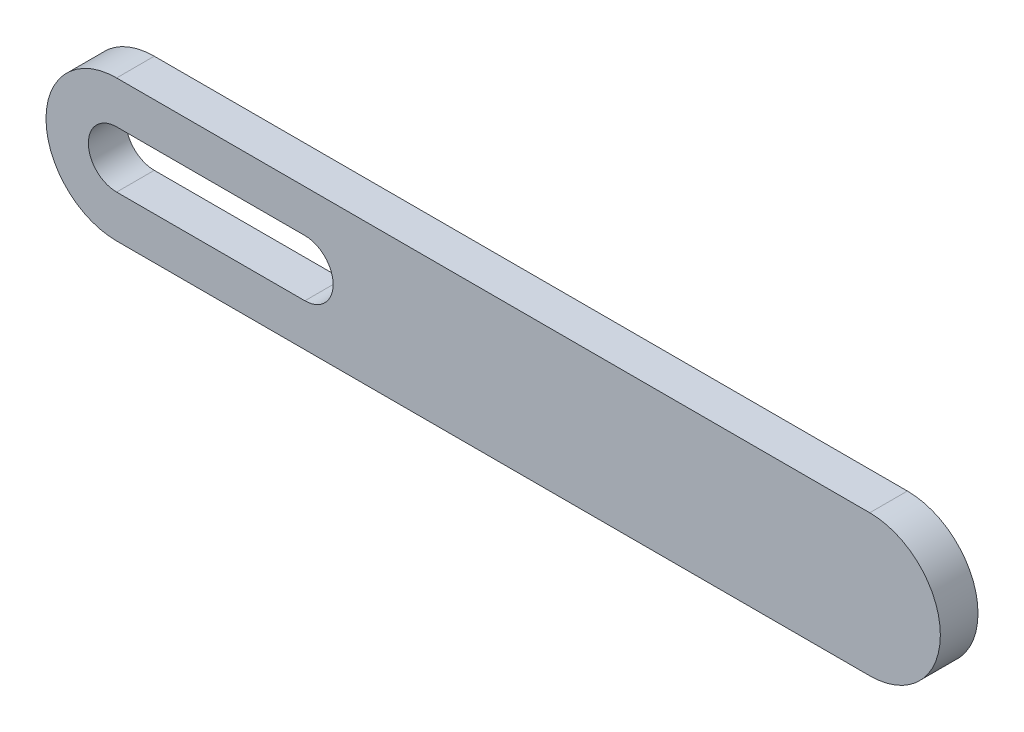
ISO-10303-21;
HEADER;
FILE_DESCRIPTION(('STEP AP214'),'2;1');
FILE_NAME('part.step','',(''),(''),'','','');
FILE_SCHEMA(('AUTOMOTIVE_DESIGN { 1 0 10303 214 1 1 1 1 }'));
ENDSEC;
DATA;
#1=APPLICATION_CONTEXT('core data for automotive mechanical design processes');
#2=APPLICATION_PROTOCOL_DEFINITION('international standard','automotive_design',2000,#1);
#3=PRODUCT_CONTEXT('',#1,'mechanical');
#4=PRODUCT('Part','Part','',(#3));
#5=PRODUCT_RELATED_PRODUCT_CATEGORY('part','',(#4));
#6=PRODUCT_DEFINITION_FORMATION('','',#4);
#7=PRODUCT_DEFINITION_CONTEXT('part definition',#1,'design');
#8=PRODUCT_DEFINITION('design','',#6,#7);
#9=PRODUCT_DEFINITION_SHAPE('','',#8);
#10=(LENGTH_UNIT() NAMED_UNIT(*) SI_UNIT(.MILLI.,.METRE.));
#11=(NAMED_UNIT(*) PLANE_ANGLE_UNIT() SI_UNIT($,.RADIAN.));
#12=(NAMED_UNIT(*) SI_UNIT($,.STERADIAN.) SOLID_ANGLE_UNIT());
#13=UNCERTAINTY_MEASURE_WITH_UNIT(LENGTH_MEASURE(1.E-05),#10,'distance_accuracy_value','');
#14=(GEOMETRIC_REPRESENTATION_CONTEXT(3) GLOBAL_UNCERTAINTY_ASSIGNED_CONTEXT((#13)) GLOBAL_UNIT_ASSIGNED_CONTEXT((#10,
#11,#12)) REPRESENTATION_CONTEXT('',''));
#15=CARTESIAN_POINT('',(0.,0.,0.));
#16=DIRECTION('',(0.,0.,1.));
#17=DIRECTION('',(1.,0.,0.));
#18=AXIS2_PLACEMENT_3D('',#15,#16,#17);
#19=CARTESIAN_POINT('',(0.,0.,10.));
#20=DIRECTION('',(0.,0.,1.));
#21=DIRECTION('',(1.,0.,0.));
#22=AXIS2_PLACEMENT_3D('',#19,#20,#21);
#23=PLANE('',#22);
#24=CARTESIAN_POINT('',(0.,0.,10.));
#25=DIRECTION('',(0.,0.,1.));
#26=DIRECTION('',(1.,0.,0.));
#27=AXIS2_PLACEMENT_3D('',#24,#25,#26);
#28=CIRCLE('',#27,37.5);
#29=CARTESIAN_POINT('',(0.,37.5,10.));
#30=VERTEX_POINT('',#29);
#31=CARTESIAN_POINT('',(0.,-37.5,10.));
#32=VERTEX_POINT('',#31);
#33=EDGE_CURVE('E141',#30,#32,#28,.T.);
#34=ORIENTED_EDGE('',*,*,#33,.T.);
#35=DIRECTION('',(1.,0.,0.));
#36=VECTOR('',#35,1.);
#37=CARTESIAN_POINT('',(0.,-37.5,10.));
#38=LINE('',#37,#36);
#39=CARTESIAN_POINT('',(400.,-37.5,10.));
#40=VERTEX_POINT('',#39);
#41=EDGE_CURVE('E144',#32,#40,#38,.T.);
#42=ORIENTED_EDGE('',*,*,#41,.T.);
#43=CARTESIAN_POINT('',(400.,0.,10.));
#44=DIRECTION('',(0.,0.,1.));
#45=DIRECTION('',(1.,0.,0.));
#46=AXIS2_PLACEMENT_3D('',#43,#44,#45);
#47=CIRCLE('',#46,37.5);
#48=CARTESIAN_POINT('',(400.,37.5,10.));
#49=VERTEX_POINT('',#48);
#50=EDGE_CURVE('E147',#40,#49,#47,.T.);
#51=ORIENTED_EDGE('',*,*,#50,.T.);
#52=DIRECTION('',(-1.,0.,0.));
#53=VECTOR('',#52,1.);
#54=CARTESIAN_POINT('',(0.,37.5,10.));
#55=LINE('',#54,#53);
#56=EDGE_CURVE('E149',#49,#30,#55,.T.);
#57=ORIENTED_EDGE('',*,*,#56,.T.);
#58=EDGE_LOOP('',(#34,#42,#51,#57));
#59=FACE_BOUND('',#58,.T.);
#60=DIRECTION('',(1.,0.,0.));
#61=VECTOR('',#60,1.);
#62=CARTESIAN_POINT('',(0.,-15.,10.));
#63=LINE('',#62,#61);
#64=CARTESIAN_POINT('',(0.,-15.,10.));
#65=VERTEX_POINT('',#64);
#66=CARTESIAN_POINT('',(100.,-15.,10.));
#67=VERTEX_POINT('',#66);
#68=EDGE_CURVE('E113',#65,#67,#63,.T.);
#69=ORIENTED_EDGE('',*,*,#68,.F.);
#70=CARTESIAN_POINT('',(0.,0.,10.));
#71=DIRECTION('',(0.,0.,1.));
#72=DIRECTION('',(1.,0.,0.));
#73=AXIS2_PLACEMENT_3D('',#70,#71,#72);
#74=CIRCLE('',#73,15.);
#75=CARTESIAN_POINT('',(0.,15.,10.));
#76=VERTEX_POINT('',#75);
#77=EDGE_CURVE('E105',#76,#65,#74,.T.);
#78=ORIENTED_EDGE('',*,*,#77,.F.);
#79=DIRECTION('',(-1.,0.,0.));
#80=VECTOR('',#79,1.);
#81=CARTESIAN_POINT('',(0.,15.,10.));
#82=LINE('',#81,#80);
#83=CARTESIAN_POINT('',(100.,15.,10.));
#84=VERTEX_POINT('',#83);
#85=EDGE_CURVE('E127',#84,#76,#82,.T.);
#86=ORIENTED_EDGE('',*,*,#85,.F.);
#87=CARTESIAN_POINT('',(100.,0.,10.));
#88=DIRECTION('',(0.,0.,1.));
#89=DIRECTION('',(1.,0.,0.));
#90=AXIS2_PLACEMENT_3D('',#87,#88,#89);
#91=CIRCLE('',#90,15.);
#92=EDGE_CURVE('E125',#67,#84,#91,.T.);
#93=ORIENTED_EDGE('',*,*,#92,.F.);
#94=EDGE_LOOP('',(#69,#78,#86,#93));
#95=FACE_BOUND('',#94,.T.);
#96=ADVANCED_FACE('F40',(#59,#95),#23,.T.);
#97=CARTESIAN_POINT('',(0.,0.,-10.));
#98=DIRECTION('',(0.,0.,1.));
#99=DIRECTION('',(1.,0.,0.));
#100=AXIS2_PLACEMENT_3D('',#97,#98,#99);
#101=PLANE('',#100);
#102=CARTESIAN_POINT('',(0.,0.,-10.));
#103=DIRECTION('',(0.,0.,1.));
#104=DIRECTION('',(1.,0.,0.));
#105=AXIS2_PLACEMENT_3D('',#102,#103,#104);
#106=CIRCLE('',#105,37.5);
#107=CARTESIAN_POINT('',(0.,37.5,-10.));
#108=VERTEX_POINT('',#107);
#109=CARTESIAN_POINT('',(0.,-37.5,-10.));
#110=VERTEX_POINT('',#109);
#111=EDGE_CURVE('E121',#108,#110,#106,.T.);
#112=ORIENTED_EDGE('',*,*,#111,.F.);
#113=DIRECTION('',(-1.,0.,0.));
#114=VECTOR('',#113,1.);
#115=CARTESIAN_POINT('',(0.,37.5,-10.));
#116=LINE('',#115,#114);
#117=CARTESIAN_POINT('',(400.,37.5,-10.));
#118=VERTEX_POINT('',#117);
#119=EDGE_CURVE('E145',#118,#108,#116,.T.);
#120=ORIENTED_EDGE('',*,*,#119,.F.);
#121=CARTESIAN_POINT('',(400.,0.,-10.));
#122=DIRECTION('',(0.,0.,1.));
#123=DIRECTION('',(1.,0.,0.));
#124=AXIS2_PLACEMENT_3D('',#121,#122,#123);
#125=CIRCLE('',#124,37.5);
#126=CARTESIAN_POINT('',(400.,-37.5,-10.));
#127=VERTEX_POINT('',#126);
#128=EDGE_CURVE('E156',#127,#118,#125,.T.);
#129=ORIENTED_EDGE('',*,*,#128,.F.);
#130=DIRECTION('',(1.,0.,0.));
#131=VECTOR('',#130,1.);
#132=CARTESIAN_POINT('',(0.,-37.5,-10.));
#133=LINE('',#132,#131);
#134=EDGE_CURVE('E154',#110,#127,#133,.T.);
#135=ORIENTED_EDGE('',*,*,#134,.F.);
#136=EDGE_LOOP('',(#112,#120,#129,#135));
#137=FACE_BOUND('',#136,.T.);
#138=CARTESIAN_POINT('',(0.,0.,-10.));
#139=DIRECTION('',(0.,0.,1.));
#140=DIRECTION('',(1.,0.,0.));
#141=AXIS2_PLACEMENT_3D('',#138,#139,#140);
#142=CIRCLE('',#141,15.);
#143=CARTESIAN_POINT('',(0.,15.,-10.));
#144=VERTEX_POINT('',#143);
#145=CARTESIAN_POINT('',(0.,-15.,-10.));
#146=VERTEX_POINT('',#145);
#147=EDGE_CURVE('E63',#144,#146,#142,.T.);
#148=ORIENTED_EDGE('',*,*,#147,.T.);
#149=DIRECTION('',(1.,0.,0.));
#150=VECTOR('',#149,1.);
#151=CARTESIAN_POINT('',(0.,-15.,-10.));
#152=LINE('',#151,#150);
#153=CARTESIAN_POINT('',(100.,-15.,-10.));
#154=VERTEX_POINT('',#153);
#155=EDGE_CURVE('E120',#146,#154,#152,.T.);
#156=ORIENTED_EDGE('',*,*,#155,.T.);
#157=CARTESIAN_POINT('',(100.,0.,-10.));
#158=DIRECTION('',(0.,0.,1.));
#159=DIRECTION('',(1.,0.,0.));
#160=AXIS2_PLACEMENT_3D('',#157,#158,#159);
#161=CIRCLE('',#160,15.);
#162=CARTESIAN_POINT('',(100.,15.,-10.));
#163=VERTEX_POINT('',#162);
#164=EDGE_CURVE('E133',#154,#163,#161,.T.);
#165=ORIENTED_EDGE('',*,*,#164,.T.);
#166=DIRECTION('',(-1.,0.,0.));
#167=VECTOR('',#166,1.);
#168=CARTESIAN_POINT('',(0.,15.,-10.));
#169=LINE('',#168,#167);
#170=EDGE_CURVE('E114',#163,#144,#169,.T.);
#171=ORIENTED_EDGE('',*,*,#170,.T.);
#172=EDGE_LOOP('',(#148,#156,#165,#171));
#173=FACE_BOUND('',#172,.T.);
#174=ADVANCED_FACE('F174',(#137,#173),#101,.F.);
#175=CARTESIAN_POINT('',(0.,0.,10.));
#176=DIRECTION('',(0.,0.,-1.));
#177=DIRECTION('',(-1.,0.,0.));
#178=AXIS2_PLACEMENT_3D('',#175,#176,#177);
#179=CYLINDRICAL_SURFACE('',#178,37.5);
#180=ORIENTED_EDGE('',*,*,#111,.T.);
#181=DIRECTION('',(0.,0.,-1.));
#182=VECTOR('',#181,1.);
#183=CARTESIAN_POINT('',(0.,-37.5,10.));
#184=LINE('',#183,#182);
#185=EDGE_CURVE('E11',#32,#110,#184,.T.);
#186=ORIENTED_EDGE('',*,*,#185,.F.);
#187=ORIENTED_EDGE('',*,*,#33,.F.);
#188=DIRECTION('',(0.,0.,-1.));
#189=VECTOR('',#188,1.);
#190=CARTESIAN_POINT('',(0.,37.5,10.));
#191=LINE('',#190,#189);
#192=EDGE_CURVE('E151',#30,#108,#191,.T.);
#193=ORIENTED_EDGE('',*,*,#192,.T.);
#194=EDGE_LOOP('',(#180,#186,#187,#193));
#195=FACE_BOUND('',#194,.T.);
#196=ADVANCED_FACE('F42',(#195),#179,.T.);
#197=CARTESIAN_POINT('',(0.,-37.5,10.));
#198=DIRECTION('',(0.,1.,0.));
#199=DIRECTION('',(0.,0.,1.));
#200=AXIS2_PLACEMENT_3D('',#197,#198,#199);
#201=PLANE('',#200);
#202=ORIENTED_EDGE('',*,*,#134,.T.);
#203=DIRECTION('',(0.,0.,-1.));
#204=VECTOR('',#203,1.);
#205=CARTESIAN_POINT('',(400.,-37.5,10.));
#206=LINE('',#205,#204);
#207=EDGE_CURVE('E48',#40,#127,#206,.T.);
#208=ORIENTED_EDGE('',*,*,#207,.F.);
#209=ORIENTED_EDGE('',*,*,#41,.F.);
#210=ORIENTED_EDGE('',*,*,#185,.T.);
#211=EDGE_LOOP('',(#202,#208,#209,#210));
#212=FACE_BOUND('',#211,.T.);
#213=ADVANCED_FACE('F184',(#212),#201,.F.);
#214=CARTESIAN_POINT('',(400.,0.,10.));
#215=DIRECTION('',(0.,0.,-1.));
#216=DIRECTION('',(-1.,0.,0.));
#217=AXIS2_PLACEMENT_3D('',#214,#215,#216);
#218=CYLINDRICAL_SURFACE('',#217,37.5);
#219=ORIENTED_EDGE('',*,*,#128,.T.);
#220=DIRECTION('',(0.,0.,-1.));
#221=VECTOR('',#220,1.);
#222=CARTESIAN_POINT('',(400.,37.5,10.));
#223=LINE('',#222,#221);
#224=EDGE_CURVE('E161',#49,#118,#223,.T.);
#225=ORIENTED_EDGE('',*,*,#224,.F.);
#226=ORIENTED_EDGE('',*,*,#50,.F.);
#227=ORIENTED_EDGE('',*,*,#207,.T.);
#228=EDGE_LOOP('',(#219,#225,#226,#227));
#229=FACE_BOUND('',#228,.T.);
#230=ADVANCED_FACE('F168',(#229),#218,.T.);
#231=CARTESIAN_POINT('',(0.,37.5,10.));
#232=DIRECTION('',(0.,-1.,0.));
#233=DIRECTION('',(0.,0.,-1.));
#234=AXIS2_PLACEMENT_3D('',#231,#232,#233);
#235=PLANE('',#234);
#236=ORIENTED_EDGE('',*,*,#119,.T.);
#237=ORIENTED_EDGE('',*,*,#192,.F.);
#238=ORIENTED_EDGE('',*,*,#56,.F.);
#239=ORIENTED_EDGE('',*,*,#224,.T.);
#240=EDGE_LOOP('',(#236,#237,#238,#239));
#241=FACE_BOUND('',#240,.T.);
#242=ADVANCED_FACE('F178',(#241),#235,.F.);
#243=CARTESIAN_POINT('',(0.,0.,10.));
#244=DIRECTION('',(0.,0.,-1.));
#245=DIRECTION('',(-1.,0.,0.));
#246=AXIS2_PLACEMENT_3D('',#243,#244,#245);
#247=CYLINDRICAL_SURFACE('',#246,15.);
#248=ORIENTED_EDGE('',*,*,#147,.F.);
#249=DIRECTION('',(0.,0.,-1.));
#250=VECTOR('',#249,1.);
#251=CARTESIAN_POINT('',(0.,15.,10.));
#252=LINE('',#251,#250);
#253=EDGE_CURVE('E109',#76,#144,#252,.T.);
#254=ORIENTED_EDGE('',*,*,#253,.F.);
#255=ORIENTED_EDGE('',*,*,#77,.T.);
#256=DIRECTION('',(0.,0.,-1.));
#257=VECTOR('',#256,1.);
#258=CARTESIAN_POINT('',(0.,-15.,10.));
#259=LINE('',#258,#257);
#260=EDGE_CURVE('E108',#65,#146,#259,.T.);
#261=ORIENTED_EDGE('',*,*,#260,.T.);
#262=EDGE_LOOP('',(#248,#254,#255,#261));
#263=FACE_BOUND('',#262,.T.);
#264=ADVANCED_FACE('F107',(#263),#247,.F.);
#265=CARTESIAN_POINT('',(0.,-15.,10.));
#266=DIRECTION('',(0.,1.,0.));
#267=DIRECTION('',(0.,0.,1.));
#268=AXIS2_PLACEMENT_3D('',#265,#266,#267);
#269=PLANE('',#268);
#270=ORIENTED_EDGE('',*,*,#155,.F.);
#271=ORIENTED_EDGE('',*,*,#260,.F.);
#272=ORIENTED_EDGE('',*,*,#68,.T.);
#273=DIRECTION('',(0.,0.,-1.));
#274=VECTOR('',#273,1.);
#275=CARTESIAN_POINT('',(100.,-15.,10.));
#276=LINE('',#275,#274);
#277=EDGE_CURVE('E122',#67,#154,#276,.T.);
#278=ORIENTED_EDGE('',*,*,#277,.T.);
#279=EDGE_LOOP('',(#270,#271,#272,#278));
#280=FACE_BOUND('',#279,.T.);
#281=ADVANCED_FACE('F117',(#280),#269,.T.);
#282=CARTESIAN_POINT('',(100.,0.,10.));
#283=DIRECTION('',(0.,0.,-1.));
#284=DIRECTION('',(-1.,0.,0.));
#285=AXIS2_PLACEMENT_3D('',#282,#283,#284);
#286=CYLINDRICAL_SURFACE('',#285,15.);
#287=ORIENTED_EDGE('',*,*,#164,.F.);
#288=ORIENTED_EDGE('',*,*,#277,.F.);
#289=ORIENTED_EDGE('',*,*,#92,.T.);
#290=DIRECTION('',(0.,0.,-1.));
#291=VECTOR('',#290,1.);
#292=CARTESIAN_POINT('',(100.,15.,10.));
#293=LINE('',#292,#291);
#294=EDGE_CURVE('E55',#84,#163,#293,.T.);
#295=ORIENTED_EDGE('',*,*,#294,.T.);
#296=EDGE_LOOP('',(#287,#288,#289,#295));
#297=FACE_BOUND('',#296,.T.);
#298=ADVANCED_FACE('F207',(#297),#286,.F.);
#299=CARTESIAN_POINT('',(0.,15.,10.));
#300=DIRECTION('',(0.,-1.,0.));
#301=DIRECTION('',(0.,0.,-1.));
#302=AXIS2_PLACEMENT_3D('',#299,#300,#301);
#303=PLANE('',#302);
#304=ORIENTED_EDGE('',*,*,#170,.F.);
#305=ORIENTED_EDGE('',*,*,#294,.F.);
#306=ORIENTED_EDGE('',*,*,#85,.T.);
#307=ORIENTED_EDGE('',*,*,#253,.T.);
#308=EDGE_LOOP('',(#304,#305,#306,#307));
#309=FACE_BOUND('',#308,.T.);
#310=ADVANCED_FACE('F211',(#309),#303,.T.);
#311=CLOSED_SHELL('',(#96,#174,#196,#213,#230,#242,#264,#281,#298,#310));
#312=MANIFOLD_SOLID_BREP('B2',#311);
#313=ADVANCED_BREP_SHAPE_REPRESENTATION('',(#18,#312),#14);
#314=SHAPE_DEFINITION_REPRESENTATION(#9,#313);
ENDSEC;
END-ISO-10303-21;
